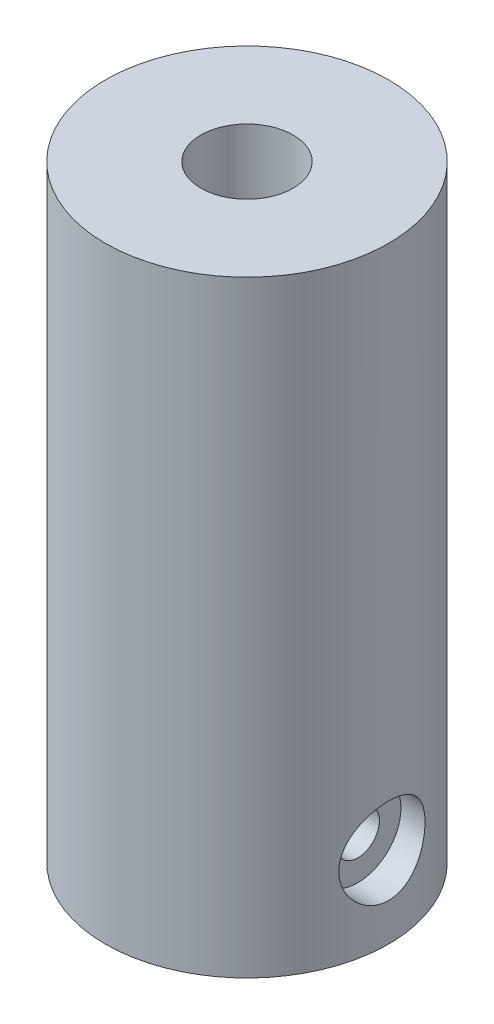
ISO-10303-21;
HEADER;
FILE_DESCRIPTION(('STEP AP214'),'2;1');
FILE_NAME('part.step','',(''),(''),'','','');
FILE_SCHEMA(('AUTOMOTIVE_DESIGN { 1 0 10303 214 1 1 1 1 }'));
ENDSEC;
DATA;
#1=APPLICATION_CONTEXT('core data for automotive mechanical design processes');
#2=APPLICATION_PROTOCOL_DEFINITION('international standard','automotive_design',2000,#1);
#3=PRODUCT_CONTEXT('',#1,'mechanical');
#4=PRODUCT('Part','Part','',(#3));
#5=PRODUCT_RELATED_PRODUCT_CATEGORY('part','',(#4));
#6=PRODUCT_DEFINITION_FORMATION('','',#4);
#7=PRODUCT_DEFINITION_CONTEXT('part definition',#1,'design');
#8=PRODUCT_DEFINITION('design','',#6,#7);
#9=PRODUCT_DEFINITION_SHAPE('','',#8);
#10=(LENGTH_UNIT() NAMED_UNIT(*) SI_UNIT(.MILLI.,.METRE.));
#11=(NAMED_UNIT(*) PLANE_ANGLE_UNIT() SI_UNIT($,.RADIAN.));
#12=(NAMED_UNIT(*) SI_UNIT($,.STERADIAN.) SOLID_ANGLE_UNIT());
#13=UNCERTAINTY_MEASURE_WITH_UNIT(LENGTH_MEASURE(1.E-05),#10,'distance_accuracy_value','');
#14=(GEOMETRIC_REPRESENTATION_CONTEXT(3) GLOBAL_UNCERTAINTY_ASSIGNED_CONTEXT((#13)) GLOBAL_UNIT_ASSIGNED_CONTEXT((#10,
#11,#12)) REPRESENTATION_CONTEXT('',''));
#15=CARTESIAN_POINT('',(0.,0.,0.));
#16=DIRECTION('',(0.,0.,1.));
#17=DIRECTION('',(1.,0.,0.));
#18=AXIS2_PLACEMENT_3D('',#15,#16,#17);
#19=CARTESIAN_POINT('',(0.,38.1,0.));
#20=DIRECTION('',(0.,-1.,0.));
#21=DIRECTION('',(0.,0.,-1.));
#22=AXIS2_PLACEMENT_3D('',#19,#20,#21);
#23=CYLINDRICAL_SURFACE('',#22,8.89);
#24=CARTESIAN_POINT('',(8.4680376370857,5.08,-2.70637));
#25=CARTESIAN_POINT('',(8.46803896719904,4.93181301012897,-2.70636843941542));
#26=CARTESIAN_POINT('',(8.47197001297453,4.78361057456002,-2.69415768865538));
#27=CARTESIAN_POINT('',(8.48720430834443,4.49154594303486,-2.64576799694643));
#28=CARTESIAN_POINT('',(8.49850985435336,4.3476851136569,-2.60958158993866));
#29=CARTESIAN_POINT('',(8.52709659207658,4.06857490018598,-2.51458909526547));
#30=CARTESIAN_POINT('',(8.54436761878323,3.93331132786647,-2.45582146631993));
#31=CARTESIAN_POINT('',(8.58292542145342,3.67452856753267,-2.31746179696847));
#32=CARTESIAN_POINT('',(8.60421283689558,3.55101125444283,-2.23786643964576));
#33=CARTESIAN_POINT('',(8.64918299748507,3.31520146900031,-2.05733300452281));
#34=CARTESIAN_POINT('',(8.67291792247797,3.20334831959752,-1.95583395586311));
#35=CARTESIAN_POINT('',(8.71966364392808,2.99795898504235,-1.73557586320138));
#36=CARTESIAN_POINT('',(8.74267434420778,2.904425224174,-1.61681453842548));
#37=CARTESIAN_POINT('',(8.78597309942131,2.73641122417831,-1.36226671071989));
#38=CARTESIAN_POINT('',(8.80619252343534,2.6623804974188,-1.2261708102948));
#39=CARTESIAN_POINT('',(8.84102321914153,2.53842826226651,-0.942740565473365));
#40=CARTESIAN_POINT('',(8.85563573807024,2.48850139141601,-0.795408729223285));
#41=CARTESIAN_POINT('',(8.87723693507584,2.41563252114698,-0.498286298427889));
#42=CARTESIAN_POINT('',(8.88443713270256,2.39194028892662,-0.348695354093538));
#43=CARTESIAN_POINT('',(8.89114806941447,2.36983930231548,-0.0474999647885784));
#44=CARTESIAN_POINT('',(8.89066047002779,2.37142508470476,0.104104038032158));
#45=CARTESIAN_POINT('',(8.88219948453857,2.39933504973611,0.399752862175002));
#46=CARTESIAN_POINT('',(8.87447203839794,2.42484649812411,0.543882560547634));
#47=CARTESIAN_POINT('',(8.85269978177035,2.49855393286668,0.825708349959296));
#48=CARTESIAN_POINT('',(8.83865456679723,2.54675137166867,0.963404028446176));
#49=CARTESIAN_POINT('',(8.80548836336735,2.66500306052333,1.23036514585822));
#50=CARTESIAN_POINT('',(8.78630914885445,2.73530976592681,1.35951122658127));
#51=CARTESIAN_POINT('',(8.74490452700263,2.89558356187705,1.60442991065072));
#52=CARTESIAN_POINT('',(8.72267838049663,2.98555542622887,1.72019925628549));
#53=CARTESIAN_POINT('',(8.67651398363185,3.18680588642767,1.93992714035124));
#54=CARTESIAN_POINT('',(8.65254279034439,3.29878778094058,2.04323547509623));
#55=CARTESIAN_POINT('',(8.60635693304206,3.53871707787483,2.22979393561093));
#56=CARTESIAN_POINT('',(8.58414245473019,3.66666616451812,2.31304194269508));
#57=CARTESIAN_POINT('',(8.5438247085348,3.9366534556744,2.4578219139451));
#58=CARTESIAN_POINT('',(8.52576537786988,4.07882128112935,2.51912529511572));
#59=CARTESIAN_POINT('',(8.4963218253761,4.37214182765289,2.61672392620363));
#60=CARTESIAN_POINT('',(8.4849353495498,4.52329149575693,2.65302762139292));
#61=CARTESIAN_POINT('',(8.47062339663903,4.82408242159914,2.69836735210333));
#62=CARTESIAN_POINT('',(8.46739061679466,4.97355979889662,2.70839432159604));
#63=CARTESIAN_POINT('',(8.46890111854106,5.27206761902859,2.70366834016933));
#64=CARTESIAN_POINT('',(8.47364324363514,5.42109812352763,2.6889189822386));
#65=CARTESIAN_POINT('',(8.49026699837362,5.7103022598401,2.63594262431424));
#66=CARTESIAN_POINT('',(8.50195245679395,5.85060637823628,2.59836010092238));
#67=CARTESIAN_POINT('',(8.53094136468852,6.12290574553298,2.50153480850944));
#68=CARTESIAN_POINT('',(8.5482456989392,6.25489968195989,2.44228862803457));
#69=CARTESIAN_POINT('',(8.58711369281648,6.51084565961092,2.3019564445891));
#70=CARTESIAN_POINT('',(8.60878136888691,6.63447686060166,2.22031481209623));
#71=CARTESIAN_POINT('',(8.65371406201051,6.86664612733961,2.03816513877644));
#72=CARTESIAN_POINT('',(8.67697947195053,6.97518046073416,1.93765244689591));
#73=CARTESIAN_POINT('',(8.72358503628698,7.1784413522229,1.71594464004766));
#74=CARTESIAN_POINT('',(8.74689267101879,7.27246371192148,1.59409543623528));
#75=CARTESIAN_POINT('',(8.7900446201902,7.4387475399042,1.33579030377408));
#76=CARTESIAN_POINT('',(8.80988910249557,7.51101006305334,1.19933508362494));
#77=CARTESIAN_POINT('',(8.84376008790929,7.63102606932774,0.91657411843505));
#78=CARTESIAN_POINT('',(8.85782951374931,7.67896102049265,0.770350799898651));
#79=CARTESIAN_POINT('',(8.87875448172048,7.74941312361723,0.471417372801376));
#80=CARTESIAN_POINT('',(8.88561215511826,7.77193778514347,0.318709194578199));
#81=CARTESIAN_POINT('',(8.89120716982155,7.79034509386401,0.0176396183351104));
#82=CARTESIAN_POINT('',(8.8902553468588,7.78724752296105,-0.130654416260891));
#83=CARTESIAN_POINT('',(8.88107510417708,7.75694603848269,-0.42451582864943));
#84=CARTESIAN_POINT('',(8.87284711832029,7.72974356223155,-0.570083368488591));
#85=CARTESIAN_POINT('',(8.85013111740501,7.65264213198044,-0.852746403615514));
#86=CARTESIAN_POINT('',(8.83571517186983,7.60300413628241,-0.989919270755703));
#87=CARTESIAN_POINT('',(8.80211233562792,7.48267485091036,-1.25405952279708));
#88=CARTESIAN_POINT('',(8.78292464823065,7.41198004519904,-1.38102519881567));
#89=CARTESIAN_POINT('',(8.74100942749981,7.24886713932581,-1.62565923981044));
#90=CARTESIAN_POINT('',(8.71818669268818,7.15581453721976,-1.74288808359477));
#91=CARTESIAN_POINT('',(8.67186807141865,6.95176180739892,-1.96040711339397));
#92=CARTESIAN_POINT('',(8.64837199012232,6.84075644086355,-2.06069233754915));
#93=CARTESIAN_POINT('',(8.60250798997637,6.59982672676929,-2.24460084881072));
#94=CARTESIAN_POINT('',(8.58019751632381,6.46942306824997,-2.32761219410341));
#95=CARTESIAN_POINT('',(8.54017273298351,6.19585770939853,-2.47044184400423));
#96=CARTESIAN_POINT('',(8.52245633633338,6.05270184189135,-2.5302706859105));
#97=CARTESIAN_POINT('',(8.49527296129645,5.77243452087567,-2.62000243625907));
#98=CARTESIAN_POINT('',(8.48515837565977,5.63614936611256,-2.65229899853556));
#99=CARTESIAN_POINT('',(8.47154079858088,5.35991353564184,-2.69548120784159));
#100=CARTESIAN_POINT('',(8.46803638078427,5.21996365732486,-2.70637147398315));
#101=CARTESIAN_POINT('',(8.4680376370857,5.08,-2.70637));
#102=B_SPLINE_CURVE_WITH_KNOTS('',3,(#24,#25,#26,#27,#28,#29,#30,#31,#32,#33,#34,#35,#36,#37,
#38,#39,#40,#41,#42,#43,#44,#45,#46,#47,#48,#49,#50,#51,#52,#53,#54,#55,#56,#57,#58,#59,#60,#61,
#62,#63,#64,#65,#66,#67,#68,#69,#70,#71,#72,#73,#74,#75,#76,#77,#78,#79,#80,#81,#82,#83,#84,#85,
#86,#87,#88,#89,#90,#91,#92,#93,#94,#95,#96,#97,#98,#99,#100,#101),.UNSPECIFIED.,.T.,.F.,(4,2,2,
2,2,2,2,2,2,2,2,2,2,2,2,2,2,2,2,2,2,2,2,2,2,2,2,2,2,2,2,2,2,2,2,2,2,2,4),(0.,0.44404441567718,
0.888227172547131,1.33165675846109,1.77515700571264,2.23175725691169,2.68841789123402,
3.15482991200144,3.62113812080542,4.07373624058621,4.52623654376317,4.96390196486832,
5.40159541086832,5.84448017587729,6.28747257278402,6.74802754131119,7.20863113037552,
7.67390175225961,8.13901512148472,8.586317761188,9.0335555400036,9.4687210681076,9.903955152821,
10.3511544114978,10.7984640341261,11.2632310699085,11.7279755712646,12.1892004561433,
12.6502889983383,13.0931169427739,13.5359184840973,13.9736970961048,14.4115488488042,
14.8637117854805,15.3160069073045,15.7823043482577,16.2483895905923,16.6678832032075,
17.0872862863456),.UNSPECIFIED.);
#103=CARTESIAN_POINT('',(8.4680376370857,5.08,-2.70637));
#104=VERTEX_POINT('',#103);
#105=EDGE_CURVE('E10',#104,#104,#102,.T.);
#106=ORIENTED_EDGE('',*,*,#105,.T.);
#107=EDGE_LOOP('',(#106));
#108=FACE_BOUND('',#107,.T.);
#109=CARTESIAN_POINT('',(0.,38.1,0.));
#110=DIRECTION('',(0.,1.,0.));
#111=DIRECTION('',(0.,0.,1.));
#112=AXIS2_PLACEMENT_3D('',#109,#110,#111);
#113=CIRCLE('',#112,8.89);
#114=CARTESIAN_POINT('',(0.,38.1,8.89));
#115=VERTEX_POINT('',#114);
#116=EDGE_CURVE('E39',#115,#115,#113,.T.);
#117=ORIENTED_EDGE('',*,*,#116,.F.);
#118=EDGE_LOOP('',(#117));
#119=FACE_BOUND('',#118,.T.);
#120=CARTESIAN_POINT('',(0.,0.,0.));
#121=DIRECTION('',(0.,1.,0.));
#122=DIRECTION('',(0.,0.,1.));
#123=AXIS2_PLACEMENT_3D('',#120,#121,#122);
#124=CIRCLE('',#123,8.89);
#125=CARTESIAN_POINT('',(0.,0.,8.89));
#126=VERTEX_POINT('',#125);
#127=EDGE_CURVE('E43',#126,#126,#124,.T.);
#128=ORIENTED_EDGE('',*,*,#127,.T.);
#129=EDGE_LOOP('',(#128));
#130=FACE_BOUND('',#129,.T.);
#131=ADVANCED_FACE('F31',(#108,#119,#130),#23,.T.);
#132=CARTESIAN_POINT('',(0.,38.1,0.));
#133=DIRECTION('',(0.,1.,0.));
#134=DIRECTION('',(0.,0.,1.));
#135=AXIS2_PLACEMENT_3D('',#132,#133,#134);
#136=PLANE('',#135);
#137=CARTESIAN_POINT('',(0.,38.1,0.));
#138=DIRECTION('',(0.,1.,0.));
#139=DIRECTION('',(0.,0.,1.));
#140=AXIS2_PLACEMENT_3D('',#137,#138,#139);
#141=CIRCLE('',#140,2.8956);
#142=CARTESIAN_POINT('',(0.,38.1,2.8956));
#143=VERTEX_POINT('',#142);
#144=EDGE_CURVE('E148',#143,#143,#141,.T.);
#145=ORIENTED_EDGE('',*,*,#144,.F.);
#146=EDGE_LOOP('',(#145));
#147=FACE_BOUND('',#146,.T.);
#148=ORIENTED_EDGE('',*,*,#116,.T.);
#149=EDGE_LOOP('',(#148));
#150=FACE_BOUND('',#149,.T.);
#151=ADVANCED_FACE('F90',(#147,#150),#136,.T.);
#152=CARTESIAN_POINT('',(0.,0.,0.));
#153=DIRECTION('',(0.,1.,0.));
#154=DIRECTION('',(0.,0.,1.));
#155=AXIS2_PLACEMENT_3D('',#152,#153,#154);
#156=PLANE('',#155);
#157=CARTESIAN_POINT('',(0.,0.,0.));
#158=DIRECTION('',(0.,1.,0.));
#159=DIRECTION('',(0.,0.,1.));
#160=AXIS2_PLACEMENT_3D('',#157,#158,#159);
#161=CIRCLE('',#160,1.74999999999999);
#162=CARTESIAN_POINT('',(0.,0.,1.74999999999999));
#163=VERTEX_POINT('',#162);
#164=EDGE_CURVE('E78',#163,#163,#161,.T.);
#165=ORIENTED_EDGE('',*,*,#164,.T.);
#166=EDGE_LOOP('',(#165));
#167=FACE_BOUND('',#166,.T.);
#168=ORIENTED_EDGE('',*,*,#127,.F.);
#169=EDGE_LOOP('',(#168));
#170=FACE_BOUND('',#169,.T.);
#171=ADVANCED_FACE('F88',(#167,#170),#156,.F.);
#172=CARTESIAN_POINT('',(0.,38.1,0.));
#173=DIRECTION('',(0.,1.,0.));
#174=DIRECTION('',(0.,0.,1.));
#175=AXIS2_PLACEMENT_3D('',#172,#173,#174);
#176=CYLINDRICAL_SURFACE('',#175,1.74999999999999);
#177=CARTESIAN_POINT('',(0.,18.361654074842,0.));
#178=DIRECTION('',(0.,1.,0.));
#179=DIRECTION('',(0.,0.,1.));
#180=AXIS2_PLACEMENT_3D('',#177,#178,#179);
#181=CIRCLE('',#180,1.74999999999999);
#182=CARTESIAN_POINT('',(0.,18.361654074842,1.74999999999999));
#183=VERTEX_POINT('',#182);
#184=EDGE_CURVE('E35',#183,#183,#181,.T.);
#185=ORIENTED_EDGE('',*,*,#184,.T.);
#186=EDGE_LOOP('',(#185));
#187=FACE_BOUND('',#186,.T.);
#188=CARTESIAN_POINT('',(1.11045418523232,5.08,-1.35255));
#189=CARTESIAN_POINT('',(1.11046060423106,5.14224954026333,-1.35254702774497));
#190=CARTESIAN_POINT('',(1.11581652157482,5.20451280543939,-1.3481992065702));
#191=CARTESIAN_POINT('',(1.13586354725032,5.32647169118882,-1.33134119057651));
#192=CARTESIAN_POINT('',(1.15059086976145,5.38615638758091,-1.31879932624303));
#193=CARTESIAN_POINT('',(1.19034750517078,5.51391638868576,-1.28312885961846));
#194=CARTESIAN_POINT('',(1.21691696939926,5.58101037876484,-1.25829599785967));
#195=CARTESIAN_POINT('',(1.27484423676586,5.70878603549583,-1.19957423909776));
#196=CARTESIAN_POINT('',(1.30620788169395,5.76945972416458,-1.16567425534833));
#197=CARTESIAN_POINT('',(1.37123027474998,5.88594730692708,-1.0885056120974));
#198=CARTESIAN_POINT('',(1.40492771772849,5.94159107644435,-1.04501368020652));
#199=CARTESIAN_POINT('',(1.47114164387515,6.04579530559269,-0.949535148437209));
#200=CARTESIAN_POINT('',(1.50365898398833,6.09436098560981,-0.897554869685833));
#201=CARTESIAN_POINT('',(1.56386249939767,6.18159187372294,-0.787769924016139));
#202=CARTESIAN_POINT('',(1.59169798485447,6.22059780200331,-0.730320545873257));
#203=CARTESIAN_POINT('',(1.64217482569287,6.29004027446957,-0.608360398167211));
#204=CARTESIAN_POINT('',(1.66482109379626,6.32048493001819,-0.543856393543553));
#205=CARTESIAN_POINT('',(1.70008795407075,6.36739678212949,-0.419211240249591));
#206=CARTESIAN_POINT('',(1.71370783087584,6.38528305709009,-0.359890483406196));
#207=CARTESIAN_POINT('',(1.73479209612193,6.41284464167488,-0.238313716264408));
#208=CARTESIAN_POINT('',(1.74226044734821,6.42252523747803,-0.176059622981296));
#209=CARTESIAN_POINT('',(1.7504202453553,6.43309796181546,-0.0501738921781698));
#210=CARTESIAN_POINT('',(1.75109201786899,6.43396457628277,0.0134612104661554));
#211=CARTESIAN_POINT('',(1.74554543740328,6.42678337632117,0.139922318266619));
#212=CARTESIAN_POINT('',(1.73932609101139,6.41873427661747,0.202748205446617));
#213=CARTESIAN_POINT('',(1.72095666324401,6.3947771604829,0.323036972116205));
#214=CARTESIAN_POINT('',(1.70907655801803,6.37922652961479,0.380614256576529));
#215=CARTESIAN_POINT('',(1.68036928628465,6.3412244348321,0.49211529509195));
#216=CARTESIAN_POINT('',(1.66354097474131,6.31877137361106,0.546038199950356));
#217=CARTESIAN_POINT('',(1.62399292761551,6.26516110911442,0.654858976451267));
#218=CARTESIAN_POINT('',(1.60084123570591,6.23333939458025,0.709269568717011));
#219=CARTESIAN_POINT('',(1.55118449709065,6.16336179914487,0.812155351602898));
#220=CARTESIAN_POINT('',(1.52467701301634,6.12520130793165,0.8606261772005));
#221=CARTESIAN_POINT('',(1.46418878704378,6.03503009373196,0.960580881583773));
#222=CARTESIAN_POINT('',(1.4297816290706,5.98177949095444,1.01068757135212));
#223=CARTESIAN_POINT('',(1.36084384669277,5.86794136610278,1.10175401274467));
#224=CARTESIAN_POINT('',(1.32631314486527,5.80734793717856,1.14270632389539));
#225=CARTESIAN_POINT('',(1.2659283730222,5.68957576003755,1.20896289765853));
#226=CARTESIAN_POINT('',(1.23958177950642,5.63347726322482,1.23573338538861));
#227=CARTESIAN_POINT('',(1.19189915080728,5.51630331532004,1.28178533076172));
#228=CARTESIAN_POINT('',(1.17055194331914,5.4552393805076,1.30108355128913));
#229=CARTESIAN_POINT('',(1.14043324425781,5.34385099943919,1.32748519336273));
#230=CARTESIAN_POINT('',(1.12987479464778,5.29445359374914,1.33640176037064));
#231=CARTESIAN_POINT('',(1.11519892360245,5.19406133363913,1.34867626141698));
#232=CARTESIAN_POINT('',(1.11107060279331,5.14306933216711,1.35204360222114));
#233=CARTESIAN_POINT('',(1.10996623835868,5.04081934232886,1.35295091791385));
#234=CARTESIAN_POINT('',(1.11300858728473,4.98956100718235,1.35047590732257));
#235=CARTESIAN_POINT('',(1.12573014821927,4.88845108852518,1.33988630979825));
#236=CARTESIAN_POINT('',(1.13541950953499,4.83860177781376,1.33176309838333));
#237=CARTESIAN_POINT('',(1.16401408213478,4.72540744624909,1.30691648537601));
#238=CARTESIAN_POINT('',(1.18490057527807,4.66300489893838,1.28824511530745));
#239=CARTESIAN_POINT('',(1.23213956932324,4.54323979304819,1.2431412517856));
#240=CARTESIAN_POINT('',(1.25850830799062,4.48589294416337,1.21668560330179));
#241=CARTESIAN_POINT('',(1.32328334453258,4.35748833901436,1.14647839922958));
#242=CARTESIAN_POINT('',(1.36271321798341,4.28848745096692,1.09990726381893));
#243=CARTESIAN_POINT('',(1.441163062664,4.15999619451185,0.994914396866702));
#244=CARTESIAN_POINT('',(1.48018323597183,4.10050090976199,0.936498827028858));
#245=CARTESIAN_POINT('',(1.54773920211093,4.00136159570764,0.819018270335716));
#246=CARTESIAN_POINT('',(1.57693209215568,3.96006197917331,0.761733760970269));
#247=CARTESIAN_POINT('',(1.63024619966466,3.88616218833795,0.639696742389237));
#248=CARTESIAN_POINT('',(1.65437536241157,3.85354836355681,0.574956183171897));
#249=CARTESIAN_POINT('',(1.69217666442943,3.80305673686392,0.450090097829711));
#250=CARTESIAN_POINT('',(1.70690816279304,3.78364987853188,0.390907166843711));
#251=CARTESIAN_POINT('',(1.73026318361459,3.75304821864966,0.269284581903356));
#252=CARTESIAN_POINT('',(1.73889002110776,3.7418489599801,0.206846715297593));
#253=CARTESIAN_POINT('',(1.74931760708422,3.72832605139161,0.0802204812756763));
#254=CARTESIAN_POINT('',(1.75109500516144,3.72603276258588,0.0160268758565686));
#255=CARTESIAN_POINT('',(1.74759324632826,3.73056466083176,-0.111841900656211));
#256=CARTESIAN_POINT('',(1.74231378120579,3.7373902461548,-0.175517048983802));
#257=CARTESIAN_POINT('',(1.72564535547791,3.75909574960575,-0.296997784734777));
#258=CARTESIAN_POINT('',(1.71460186437664,3.77352061736494,-0.354934627272485));
#259=CARTESIAN_POINT('',(1.68744090638328,3.8093761592569,-0.467321408067812));
#260=CARTESIAN_POINT('',(1.67132225018084,3.83080847555513,-0.521770525411672));
#261=CARTESIAN_POINT('',(1.63330763610714,3.88212240324981,-0.631246575943975));
#262=CARTESIAN_POINT('',(1.61101161381591,3.91260794343246,-0.685848737018344));
#263=CARTESIAN_POINT('',(1.56293397384458,3.97990520913466,-0.78930190401133));
#264=CARTESIAN_POINT('',(1.53715012699433,4.01672098460504,-0.838149194160254));
#265=CARTESIAN_POINT('',(1.47815417628692,4.10375403671922,-0.938941151175118));
#266=CARTESIAN_POINT('',(1.44448411601107,4.15518062149617,-0.989572413073144));
#267=CARTESIAN_POINT('',(1.37661930065981,4.26522444973874,-1.08199112865999));
#268=CARTESIAN_POINT('',(1.34242409111405,4.32384826890856,-1.12377039837275));
#269=CARTESIAN_POINT('',(1.28052421367703,4.44063643285033,-1.19359392203676));
#270=CARTESIAN_POINT('',(1.25253184243455,4.49802175501322,-1.22268199406884));
#271=CARTESIAN_POINT('',(1.20142070172169,4.61821144480531,-1.2729375515945));
#272=CARTESIAN_POINT('',(1.1782940187585,4.68100677545983,-1.29411794219035));
#273=CARTESIAN_POINT('',(1.1441995117997,4.79952129081362,-1.32428638889606));
#274=CARTESIAN_POINT('',(1.13177689034009,4.85441409160179,-1.33480140766145));
#275=CARTESIAN_POINT('',(1.11491253527813,4.96620484774586,-1.34892484195107));
#276=CARTESIAN_POINT('',(1.11044831752188,5.02309668954711,-1.35255271698634));
#277=CARTESIAN_POINT('',(1.11045418523232,5.08,-1.35255));
#278=B_SPLINE_CURVE_WITH_KNOTS('',3,(#188,#189,#190,#191,#192,#193,#194,#195,#196,#197,#198,
#199,#200,#201,#202,#203,#204,#205,#206,#207,#208,#209,#210,#211,#212,#213,#214,#215,#216,#217,
#218,#219,#220,#221,#222,#223,#224,#225,#226,#227,#228,#229,#230,#231,#232,#233,#234,#235,#236,
#237,#238,#239,#240,#241,#242,#243,#244,#245,#246,#247,#248,#249,#250,#251,#252,#253,#254,#255,
#256,#257,#258,#259,#260,#261,#262,#263,#264,#265,#266,#267,#268,#269,#270,#271,#272,#273,#274,
#275,#276,#277),.UNSPECIFIED.,.T.,.F.,(4,2,2,2,2,2,2,2,2,2,2,2,2,2,2,2,2,2,2,2,2,2,2,2,2,2,2,2,
2,2,2,2,2,2,2,2,2,2,2,2,2,2,2,2,4),(0.,0.186447117122025,0.373619139026261,0.601317392371609,
0.829295344798103,1.06327887176304,1.29708894319286,1.52064778276738,1.74399409274169,
1.93349089881437,2.12286553620721,2.31278820593088,2.50273825816005,2.68441900807201,
2.86614183281118,3.06686019573136,3.26772518930554,3.50926202585878,3.75099447004543,
3.95292839188059,4.1544066444011,4.30766891583841,4.46067111662592,4.61406619035809,
4.76769600550384,4.97176498161452,5.17644722388864,5.45143846319325,5.72628701209103,
5.95465491423517,6.18266176958153,6.37385470418377,6.56494373478231,6.75668363316944,
6.94843190616684,7.1298211270484,7.31125288621831,7.509701135941,7.70827682431553,
7.94631291175312,8.18456812072368,8.39440873127781,8.60390537550667,8.77482334636325,
8.94525766834798),.UNSPECIFIED.);
#279=CARTESIAN_POINT('',(1.11045418523232,5.08,-1.35255));
#280=VERTEX_POINT('',#279);
#281=EDGE_CURVE('E71',#280,#280,#278,.T.);
#282=ORIENTED_EDGE('',*,*,#281,.T.);
#283=EDGE_LOOP('',(#282));
#284=FACE_BOUND('',#283,.T.);
#285=ORIENTED_EDGE('',*,*,#164,.F.);
#286=EDGE_LOOP('',(#285));
#287=FACE_BOUND('',#286,.T.);
#288=ADVANCED_FACE('F56',(#187,#284,#287),#176,.F.);
#289=CARTESIAN_POINT('',(8.89,5.08,0.));
#290=DIRECTION('',(1.,0.,0.));
#291=DIRECTION('',(0.,0.,-1.));
#292=AXIS2_PLACEMENT_3D('',#289,#290,#291);
#293=CYLINDRICAL_SURFACE('',#292,2.70637);
#294=CARTESIAN_POINT('',(6.9596,5.08,0.));
#295=DIRECTION('',(1.,0.,0.));
#296=DIRECTION('',(0.,0.,-1.));
#297=AXIS2_PLACEMENT_3D('',#294,#295,#296);
#298=CIRCLE('',#297,2.70637);
#299=CARTESIAN_POINT('',(6.9596,5.08,-2.70637));
#300=VERTEX_POINT('',#299);
#301=EDGE_CURVE('E151',#300,#300,#298,.T.);
#302=ORIENTED_EDGE('',*,*,#301,.F.);
#303=EDGE_LOOP('',(#302));
#304=FACE_BOUND('',#303,.T.);
#305=ORIENTED_EDGE('',*,*,#105,.F.);
#306=EDGE_LOOP('',(#305));
#307=FACE_BOUND('',#306,.T.);
#308=ADVANCED_FACE('F50',(#304,#307),#293,.F.);
#309=CARTESIAN_POINT('',(8.89,5.08,0.));
#310=DIRECTION('',(1.,0.,0.));
#311=DIRECTION('',(0.,0.,-1.));
#312=AXIS2_PLACEMENT_3D('',#309,#310,#311);
#313=CYLINDRICAL_SURFACE('',#312,1.35255);
#314=ORIENTED_EDGE('',*,*,#281,.F.);
#315=EDGE_LOOP('',(#314));
#316=FACE_BOUND('',#315,.T.);
#317=CARTESIAN_POINT('',(6.9596,5.08,0.));
#318=DIRECTION('',(1.,0.,0.));
#319=DIRECTION('',(0.,0.,-1.));
#320=AXIS2_PLACEMENT_3D('',#317,#318,#319);
#321=CIRCLE('',#320,1.35255);
#322=CARTESIAN_POINT('',(6.9596,5.08,-1.35255));
#323=VERTEX_POINT('',#322);
#324=EDGE_CURVE('E79',#323,#323,#321,.T.);
#325=ORIENTED_EDGE('',*,*,#324,.T.);
#326=EDGE_LOOP('',(#325));
#327=FACE_BOUND('',#326,.T.);
#328=ADVANCED_FACE('F55',(#316,#327),#313,.F.);
#329=CARTESIAN_POINT('',(6.9596,6.43255,0.));
#330=DIRECTION('',(-1.,0.,0.));
#331=DIRECTION('',(0.,0.,1.));
#332=AXIS2_PLACEMENT_3D('',#329,#330,#331);
#333=PLANE('',#332);
#334=ORIENTED_EDGE('',*,*,#324,.F.);
#335=EDGE_LOOP('',(#334));
#336=FACE_BOUND('',#335,.T.);
#337=ORIENTED_EDGE('',*,*,#301,.T.);
#338=EDGE_LOOP('',(#337));
#339=FACE_BOUND('',#338,.T.);
#340=ADVANCED_FACE('F60',(#336,#339),#333,.F.);
#341=CARTESIAN_POINT('',(0.,19.05,0.));
#342=DIRECTION('',(0.,1.,0.));
#343=DIRECTION('',(0.,0.,1.));
#344=AXIS2_PLACEMENT_3D('',#341,#342,#343);
#345=CONICAL_SURFACE('',#344,2.89559999999999,1.02974425867665);
#346=CARTESIAN_POINT('',(0.,19.05,0.));
#347=DIRECTION('',(0.,1.,0.));
#348=DIRECTION('',(0.,0.,1.));
#349=AXIS2_PLACEMENT_3D('',#346,#347,#348);
#350=CIRCLE('',#349,2.89559999999999);
#351=CARTESIAN_POINT('',(0.,19.05,2.89559999999999));
#352=VERTEX_POINT('',#351);
#353=EDGE_CURVE('E145',#352,#352,#350,.T.);
#354=ORIENTED_EDGE('',*,*,#353,.T.);
#355=EDGE_LOOP('',(#354));
#356=FACE_BOUND('',#355,.T.);
#357=ORIENTED_EDGE('',*,*,#184,.F.);
#358=EDGE_LOOP('',(#357));
#359=FACE_BOUND('',#358,.T.);
#360=ADVANCED_FACE('F58',(#356,#359),#345,.F.);
#361=CARTESIAN_POINT('',(0.,38.1,0.));
#362=DIRECTION('',(0.,1.,0.));
#363=DIRECTION('',(0.,0.,1.));
#364=AXIS2_PLACEMENT_3D('',#361,#362,#363);
#365=CYLINDRICAL_SURFACE('',#364,2.89559999999999);
#366=ORIENTED_EDGE('',*,*,#353,.F.);
#367=EDGE_LOOP('',(#366));
#368=FACE_BOUND('',#367,.T.);
#369=ORIENTED_EDGE('',*,*,#144,.T.);
#370=EDGE_LOOP('',(#369));
#371=FACE_BOUND('',#370,.T.);
#372=ADVANCED_FACE('F130',(#368,#371),#365,.F.);
#373=CLOSED_SHELL('',(#131,#151,#171,#288,#308,#328,#340,#360,#372));
#374=MANIFOLD_SOLID_BREP('B2',#373);
#375=ADVANCED_BREP_SHAPE_REPRESENTATION('',(#18,#374),#14);
#376=SHAPE_DEFINITION_REPRESENTATION(#9,#375);
ENDSEC;
END-ISO-10303-21;
